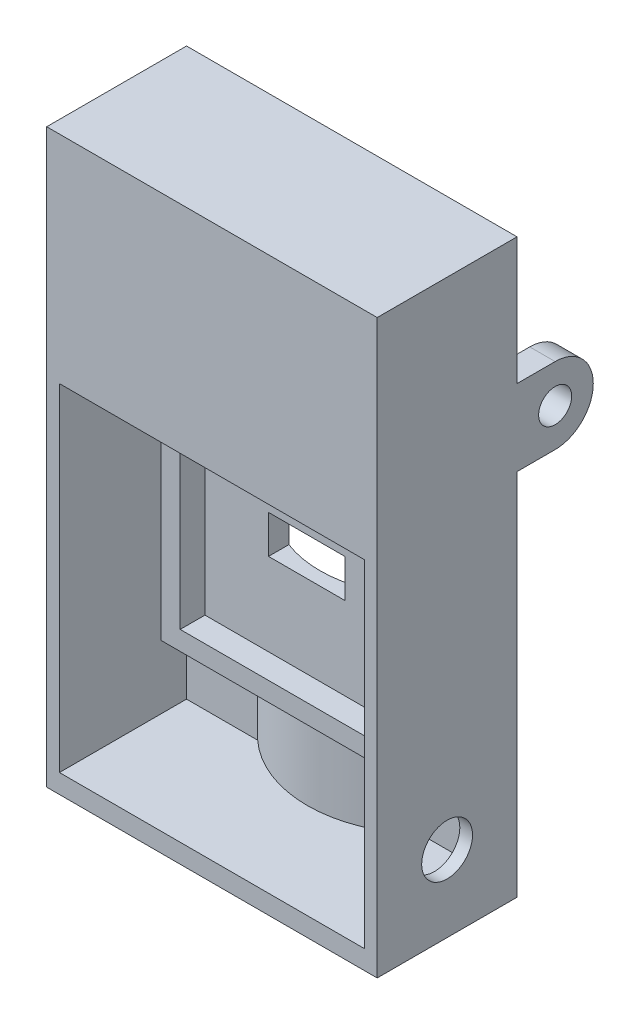
ISO-10303-21;
HEADER;
FILE_DESCRIPTION(('STEP AP214'),'2;1');
FILE_NAME('part.step','',(''),(''),'','','');
FILE_SCHEMA(('AUTOMOTIVE_DESIGN { 1 0 10303 214 1 1 1 1 }'));
ENDSEC;
DATA;
#1=APPLICATION_CONTEXT('core data for automotive mechanical design processes');
#2=APPLICATION_PROTOCOL_DEFINITION('international standard','automotive_design',2000,#1);
#3=PRODUCT_CONTEXT('',#1,'mechanical');
#4=PRODUCT('Part','Part','',(#3));
#5=PRODUCT_RELATED_PRODUCT_CATEGORY('part','',(#4));
#6=PRODUCT_DEFINITION_FORMATION('','',#4);
#7=PRODUCT_DEFINITION_CONTEXT('part definition',#1,'design');
#8=PRODUCT_DEFINITION('design','',#6,#7);
#9=PRODUCT_DEFINITION_SHAPE('','',#8);
#10=(LENGTH_UNIT() NAMED_UNIT(*) SI_UNIT(.MILLI.,.METRE.));
#11=(NAMED_UNIT(*) PLANE_ANGLE_UNIT() SI_UNIT($,.RADIAN.));
#12=(NAMED_UNIT(*) SI_UNIT($,.STERADIAN.) SOLID_ANGLE_UNIT());
#13=UNCERTAINTY_MEASURE_WITH_UNIT(LENGTH_MEASURE(1.E-05),#10,'distance_accuracy_value','');
#14=(GEOMETRIC_REPRESENTATION_CONTEXT(3) GLOBAL_UNCERTAINTY_ASSIGNED_CONTEXT((#13)) GLOBAL_UNIT_ASSIGNED_CONTEXT((#10,
#11,#12)) REPRESENTATION_CONTEXT('',''));
#15=CARTESIAN_POINT('',(0.,0.,0.));
#16=DIRECTION('',(0.,0.,1.));
#17=DIRECTION('',(1.,0.,0.));
#18=AXIS2_PLACEMENT_3D('',#15,#16,#17);
#19=CARTESIAN_POINT('',(-8.48528137423856,-16.,-3.));
#20=DIRECTION('',(0.,-1.,0.));
#21=DIRECTION('',(1.,0.,0.));
#22=AXIS2_PLACEMENT_3D('',#19,#20,#21);
#23=PLANE('',#22);
#24=DIRECTION('',(1.,0.,0.));
#25=VECTOR('',#24,1.);
#26=CARTESIAN_POINT('',(-8.48528137423856,-16.,-3.));
#27=LINE('',#26,#25);
#28=CARTESIAN_POINT('',(0.,-16.,-3.));
#29=VERTEX_POINT('',#28);
#30=CARTESIAN_POINT('',(2.,-16.,-3.));
#31=VERTEX_POINT('',#30);
#32=EDGE_CURVE('E280',#29,#31,#27,.T.);
#33=ORIENTED_EDGE('',*,*,#32,.T.);
#34=DIRECTION('',(0.,0.,1.));
#35=VECTOR('',#34,1.);
#36=CARTESIAN_POINT('',(2.,-16.,-3.));
#37=LINE('',#36,#35);
#38=CARTESIAN_POINT('',(2.,-16.,0.));
#39=VERTEX_POINT('',#38);
#40=EDGE_CURVE('E643',#31,#39,#37,.T.);
#41=ORIENTED_EDGE('',*,*,#40,.T.);
#42=DIRECTION('',(1.,0.,0.));
#43=VECTOR('',#42,1.);
#44=CARTESIAN_POINT('',(-8.48528137423856,-16.,0.));
#45=LINE('',#44,#43);
#46=CARTESIAN_POINT('',(0.,-16.,0.));
#47=VERTEX_POINT('',#46);
#48=EDGE_CURVE('E57',#47,#39,#45,.T.);
#49=ORIENTED_EDGE('',*,*,#48,.F.);
#50=DIRECTION('',(0.,0.,1.));
#51=VECTOR('',#50,1.);
#52=CARTESIAN_POINT('',(0.,-16.,-3.));
#53=LINE('',#52,#51);
#54=EDGE_CURVE('E290',#29,#47,#53,.T.);
#55=ORIENTED_EDGE('',*,*,#54,.F.);
#56=EDGE_LOOP('',(#33,#41,#49,#55));
#57=FACE_BOUND('',#56,.T.);
#58=ADVANCED_FACE('F33',(#57),#23,.T.);
#59=CARTESIAN_POINT('',(24.,-16.,0.));
#60=VERTEX_POINT('',#59);
#61=CARTESIAN_POINT('',(26.,-16.,0.));
#62=VERTEX_POINT('',#61);
#63=EDGE_CURVE('E285',#60,#62,#45,.T.);
#64=ORIENTED_EDGE('',*,*,#63,.F.);
#65=DIRECTION('',(0.,0.,-1.));
#66=VECTOR('',#65,1.);
#67=CARTESIAN_POINT('',(24.,-16.,-3.));
#68=LINE('',#67,#66);
#69=CARTESIAN_POINT('',(24.,-16.,-3.));
#70=VERTEX_POINT('',#69);
#71=EDGE_CURVE('E252',#60,#70,#68,.T.);
#72=ORIENTED_EDGE('',*,*,#71,.T.);
#73=CARTESIAN_POINT('',(26.,-16.,-3.));
#74=VERTEX_POINT('',#73);
#75=EDGE_CURVE('E283',#70,#74,#27,.T.);
#76=ORIENTED_EDGE('',*,*,#75,.T.);
#77=DIRECTION('',(0.,0.,-1.));
#78=VECTOR('',#77,1.);
#79=CARTESIAN_POINT('',(26.,-16.,-3.));
#80=LINE('',#79,#78);
#81=EDGE_CURVE('E648',#62,#74,#80,.T.);
#82=ORIENTED_EDGE('',*,*,#81,.F.);
#83=EDGE_LOOP('',(#64,#72,#76,#82));
#84=FACE_BOUND('',#83,.T.);
#85=ADVANCED_FACE('F498',(#84),#23,.T.);
#86=CARTESIAN_POINT('',(-8.48528137423856,-13.,-3.));
#87=DIRECTION('',(1.,0.,0.));
#88=DIRECTION('',(0.,1.,0.));
#89=AXIS2_PLACEMENT_3D('',#86,#87,#88);
#90=CYLINDRICAL_SURFACE('',#89,3.);
#91=DIRECTION('',(1.,0.,0.));
#92=VECTOR('',#91,1.);
#93=CARTESIAN_POINT('',(-8.48528137423856,-10.,-3.));
#94=LINE('',#93,#92);
#95=CARTESIAN_POINT('',(0.,-10.,-3.));
#96=VERTEX_POINT('',#95);
#97=CARTESIAN_POINT('',(2.,-10.,-3.));
#98=VERTEX_POINT('',#97);
#99=EDGE_CURVE('E270',#96,#98,#94,.T.);
#100=ORIENTED_EDGE('',*,*,#99,.T.);
#101=CARTESIAN_POINT('',(2.,-13.,-3.));
#102=DIRECTION('',(1.,0.,0.));
#103=DIRECTION('',(0.,0.,-1.));
#104=AXIS2_PLACEMENT_3D('',#101,#102,#103);
#105=CIRCLE('',#104,3.);
#106=EDGE_CURVE('E661',#98,#31,#105,.F.);
#107=ORIENTED_EDGE('',*,*,#106,.T.);
#108=ORIENTED_EDGE('',*,*,#32,.F.);
#109=CARTESIAN_POINT('',(0.,-13.,-3.));
#110=DIRECTION('',(1.,0.,0.));
#111=DIRECTION('',(0.,1.,0.));
#112=AXIS2_PLACEMENT_3D('',#109,#110,#111);
#113=CIRCLE('',#112,3.);
#114=EDGE_CURVE('E273',#96,#29,#113,.F.);
#115=ORIENTED_EDGE('',*,*,#114,.F.);
#116=EDGE_LOOP('',(#100,#107,#108,#115));
#117=FACE_BOUND('',#116,.T.);
#118=ADVANCED_FACE('F503',(#117),#90,.T.);
#119=ORIENTED_EDGE('',*,*,#75,.F.);
#120=CARTESIAN_POINT('',(24.,-13.,-3.));
#121=DIRECTION('',(-1.,0.,0.));
#122=DIRECTION('',(0.,0.,1.));
#123=AXIS2_PLACEMENT_3D('',#120,#121,#122);
#124=CIRCLE('',#123,3.);
#125=CARTESIAN_POINT('',(24.,-10.,-3.));
#126=VERTEX_POINT('',#125);
#127=EDGE_CURVE('E263',#70,#126,#124,.F.);
#128=ORIENTED_EDGE('',*,*,#127,.T.);
#129=CARTESIAN_POINT('',(26.,-10.,-3.));
#130=VERTEX_POINT('',#129);
#131=EDGE_CURVE('E262',#126,#130,#94,.T.);
#132=ORIENTED_EDGE('',*,*,#131,.T.);
#133=CARTESIAN_POINT('',(26.,-13.,-3.));
#134=DIRECTION('',(1.,0.,0.));
#135=DIRECTION('',(0.,-1.,0.));
#136=AXIS2_PLACEMENT_3D('',#133,#134,#135);
#137=CIRCLE('',#136,3.);
#138=EDGE_CURVE('E649',#74,#130,#137,.T.);
#139=ORIENTED_EDGE('',*,*,#138,.F.);
#140=EDGE_LOOP('',(#119,#128,#132,#139));
#141=FACE_BOUND('',#140,.T.);
#142=ADVANCED_FACE('F655',(#141),#90,.T.);
#143=CARTESIAN_POINT('',(-8.48528137423856,-10.,0.));
#144=DIRECTION('',(0.,1.,0.));
#145=DIRECTION('',(-1.,0.,0.));
#146=AXIS2_PLACEMENT_3D('',#143,#144,#145);
#147=PLANE('',#146);
#148=DIRECTION('',(1.,0.,0.));
#149=VECTOR('',#148,1.);
#150=CARTESIAN_POINT('',(-8.48528137423856,-10.,0.));
#151=LINE('',#150,#149);
#152=CARTESIAN_POINT('',(0.,-10.,0.));
#153=VERTEX_POINT('',#152);
#154=CARTESIAN_POINT('',(2.,-10.,0.));
#155=VERTEX_POINT('',#154);
#156=EDGE_CURVE('E269',#153,#155,#151,.T.);
#157=ORIENTED_EDGE('',*,*,#156,.T.);
#158=DIRECTION('',(0.,0.,-1.));
#159=VECTOR('',#158,1.);
#160=CARTESIAN_POINT('',(2.,-10.,0.));
#161=LINE('',#160,#159);
#162=EDGE_CURVE('E659',#155,#98,#161,.T.);
#163=ORIENTED_EDGE('',*,*,#162,.T.);
#164=ORIENTED_EDGE('',*,*,#99,.F.);
#165=DIRECTION('',(0.,0.,-1.));
#166=VECTOR('',#165,1.);
#167=CARTESIAN_POINT('',(0.,-10.,0.));
#168=LINE('',#167,#166);
#169=EDGE_CURVE('E638',#153,#96,#168,.T.);
#170=ORIENTED_EDGE('',*,*,#169,.F.);
#171=EDGE_LOOP('',(#157,#163,#164,#170));
#172=FACE_BOUND('',#171,.T.);
#173=ADVANCED_FACE('F669',(#172),#147,.T.);
#174=ORIENTED_EDGE('',*,*,#131,.F.);
#175=DIRECTION('',(0.,0.,1.));
#176=VECTOR('',#175,1.);
#177=CARTESIAN_POINT('',(24.,-10.,0.));
#178=LINE('',#177,#176);
#179=CARTESIAN_POINT('',(24.,-10.,0.));
#180=VERTEX_POINT('',#179);
#181=EDGE_CURVE('E249',#126,#180,#178,.T.);
#182=ORIENTED_EDGE('',*,*,#181,.T.);
#183=CARTESIAN_POINT('',(26.,-10.,0.));
#184=VERTEX_POINT('',#183);
#185=EDGE_CURVE('E260',#180,#184,#151,.T.);
#186=ORIENTED_EDGE('',*,*,#185,.T.);
#187=DIRECTION('',(0.,0.,1.));
#188=VECTOR('',#187,1.);
#189=CARTESIAN_POINT('',(26.,-10.,0.));
#190=LINE('',#189,#188);
#191=EDGE_CURVE('E277',#130,#184,#190,.T.);
#192=ORIENTED_EDGE('',*,*,#191,.F.);
#193=EDGE_LOOP('',(#174,#182,#186,#192));
#194=FACE_BOUND('',#193,.T.);
#195=ADVANCED_FACE('F258',(#194),#147,.T.);
#196=CARTESIAN_POINT('',(-8.48528137423856,-13.,-3.));
#197=DIRECTION('',(1.,0.,0.));
#198=DIRECTION('',(0.,1.,0.));
#199=AXIS2_PLACEMENT_3D('',#196,#197,#198);
#200=CYLINDRICAL_SURFACE('',#199,1.3);
#201=CARTESIAN_POINT('',(0.,-13.,-3.));
#202=DIRECTION('',(1.,0.,0.));
#203=DIRECTION('',(0.,1.,0.));
#204=AXIS2_PLACEMENT_3D('',#201,#202,#203);
#205=CIRCLE('',#204,1.3);
#206=CARTESIAN_POINT('',(0.,-11.7,-3.));
#207=VERTEX_POINT('',#206);
#208=EDGE_CURVE('E286',#207,#207,#205,.F.);
#209=ORIENTED_EDGE('',*,*,#208,.T.);
#210=EDGE_LOOP('',(#209));
#211=FACE_BOUND('',#210,.T.);
#212=CARTESIAN_POINT('',(2.,-13.,-3.));
#213=DIRECTION('',(1.,0.,0.));
#214=DIRECTION('',(0.,0.,-1.));
#215=AXIS2_PLACEMENT_3D('',#212,#213,#214);
#216=CIRCLE('',#215,1.3);
#217=CARTESIAN_POINT('',(2.,-13.,-4.3));
#218=VERTEX_POINT('',#217);
#219=EDGE_CURVE('E37',#218,#218,#216,.F.);
#220=ORIENTED_EDGE('',*,*,#219,.F.);
#221=EDGE_LOOP('',(#220));
#222=FACE_BOUND('',#221,.T.);
#223=ADVANCED_FACE('F483',(#211,#222),#200,.F.);
#224=CARTESIAN_POINT('',(26.,-13.,-3.));
#225=DIRECTION('',(1.,0.,0.));
#226=DIRECTION('',(0.,1.,0.));
#227=AXIS2_PLACEMENT_3D('',#224,#225,#226);
#228=CIRCLE('',#227,1.3);
#229=CARTESIAN_POINT('',(26.,-11.7,-3.));
#230=VERTEX_POINT('',#229);
#231=EDGE_CURVE('E646',#230,#230,#228,.T.);
#232=ORIENTED_EDGE('',*,*,#231,.T.);
#233=EDGE_LOOP('',(#232));
#234=FACE_BOUND('',#233,.T.);
#235=CARTESIAN_POINT('',(24.,-13.,-3.));
#236=DIRECTION('',(-1.,0.,0.));
#237=DIRECTION('',(0.,0.,1.));
#238=AXIS2_PLACEMENT_3D('',#235,#236,#237);
#239=CIRCLE('',#238,1.3);
#240=CARTESIAN_POINT('',(24.,-13.,-1.7));
#241=VERTEX_POINT('',#240);
#242=EDGE_CURVE('E255',#241,#241,#239,.F.);
#243=ORIENTED_EDGE('',*,*,#242,.F.);
#244=EDGE_LOOP('',(#243));
#245=FACE_BOUND('',#244,.T.);
#246=ADVANCED_FACE('F480',(#234,#245),#200,.F.);
#247=CARTESIAN_POINT('',(19.4031242374329,-17.,1.));
#248=DIRECTION('',(0.,0.,-1.));
#249=DIRECTION('',(-1.,0.,0.));
#250=AXIS2_PLACEMENT_3D('',#247,#248,#249);
#251=PLANE('',#250);
#252=DIRECTION('',(0.,1.,0.));
#253=VECTOR('',#252,1.);
#254=CARTESIAN_POINT('',(22.5,-36.,1.));
#255=LINE('',#254,#253);
#256=CARTESIAN_POINT('',(22.5,-36.,1.));
#257=VERTEX_POINT('',#256);
#258=CARTESIAN_POINT('',(22.5,-17.,1.));
#259=VERTEX_POINT('',#258);
#260=EDGE_CURVE('E365',#257,#259,#255,.T.);
#261=ORIENTED_EDGE('',*,*,#260,.F.);
#262=DIRECTION('',(1.,0.,0.));
#263=VECTOR('',#262,1.);
#264=CARTESIAN_POINT('',(22.5,-36.,1.));
#265=LINE('',#264,#263);
#266=CARTESIAN_POINT('',(19.4031242374329,-36.,1.));
#267=VERTEX_POINT('',#266);
#268=EDGE_CURVE('E341',#267,#257,#265,.T.);
#269=ORIENTED_EDGE('',*,*,#268,.F.);
#270=DIRECTION('',(0.,-1.,0.));
#271=VECTOR('',#270,1.);
#272=CARTESIAN_POINT('',(19.4031242374329,-17.,1.));
#273=LINE('',#272,#271);
#274=CARTESIAN_POINT('',(19.4031242374329,-43.5,1.));
#275=VERTEX_POINT('',#274);
#276=EDGE_CURVE('E426',#267,#275,#273,.T.);
#277=ORIENTED_EDGE('',*,*,#276,.T.);
#278=DIRECTION('',(1.,0.,0.));
#279=VECTOR('',#278,1.);
#280=CARTESIAN_POINT('',(19.4031242374329,-43.5,1.));
#281=LINE('',#280,#279);
#282=CARTESIAN_POINT('',(25.,-43.5,1.));
#283=VERTEX_POINT('',#282);
#284=EDGE_CURVE('E415',#275,#283,#281,.T.);
#285=ORIENTED_EDGE('',*,*,#284,.T.);
#286=DIRECTION('',(0.,-1.,0.));
#287=VECTOR('',#286,1.);
#288=CARTESIAN_POINT('',(25.,-17.,1.));
#289=LINE('',#288,#287);
#290=CARTESIAN_POINT('',(25.,-17.,1.));
#291=VERTEX_POINT('',#290);
#292=EDGE_CURVE('E424',#291,#283,#289,.T.);
#293=ORIENTED_EDGE('',*,*,#292,.F.);
#294=DIRECTION('',(1.,0.,0.));
#295=VECTOR('',#294,1.);
#296=CARTESIAN_POINT('',(19.4031242374329,-17.,1.));
#297=LINE('',#296,#295);
#298=EDGE_CURVE('E398',#259,#291,#297,.T.);
#299=ORIENTED_EDGE('',*,*,#298,.F.);
#300=EDGE_LOOP('',(#261,#269,#277,#285,#293,#299));
#301=FACE_BOUND('',#300,.T.);
#302=ADVANCED_FACE('F482',(#301),#251,.F.);
#303=CARTESIAN_POINT('',(1.00000000000002,-17.,1.));
#304=DIRECTION('',(0.,0.,-1.));
#305=DIRECTION('',(-1.,0.,0.));
#306=AXIS2_PLACEMENT_3D('',#303,#304,#305);
#307=PLANE('',#306);
#308=DIRECTION('',(0.,1.,0.));
#309=VECTOR('',#308,1.);
#310=CARTESIAN_POINT('',(3.50000000000001,-36.,1.));
#311=LINE('',#310,#309);
#312=CARTESIAN_POINT('',(3.50000000000001,-36.,1.));
#313=VERTEX_POINT('',#312);
#314=CARTESIAN_POINT('',(3.50000000000001,-17.,1.));
#315=VERTEX_POINT('',#314);
#316=EDGE_CURVE('E352',#313,#315,#311,.T.);
#317=ORIENTED_EDGE('',*,*,#316,.T.);
#318=DIRECTION('',(1.,0.,0.));
#319=VECTOR('',#318,1.);
#320=CARTESIAN_POINT('',(1.00000000000002,-17.,1.));
#321=LINE('',#320,#319);
#322=CARTESIAN_POINT('',(1.00000000000002,-17.,1.));
#323=VERTEX_POINT('',#322);
#324=EDGE_CURVE('E395',#323,#315,#321,.T.);
#325=ORIENTED_EDGE('',*,*,#324,.F.);
#326=DIRECTION('',(0.,-1.,0.));
#327=VECTOR('',#326,1.);
#328=CARTESIAN_POINT('',(1.00000000000002,-17.,1.));
#329=LINE('',#328,#327);
#330=CARTESIAN_POINT('',(1.00000000000002,-43.5,1.));
#331=VERTEX_POINT('',#330);
#332=EDGE_CURVE('E430',#323,#331,#329,.T.);
#333=ORIENTED_EDGE('',*,*,#332,.T.);
#334=DIRECTION('',(1.,0.,0.));
#335=VECTOR('',#334,1.);
#336=CARTESIAN_POINT('',(1.00000000000002,-43.5,1.));
#337=LINE('',#336,#335);
#338=CARTESIAN_POINT('',(6.59687576256716,-43.5,1.));
#339=VERTEX_POINT('',#338);
#340=EDGE_CURVE('E409',#331,#339,#337,.T.);
#341=ORIENTED_EDGE('',*,*,#340,.T.);
#342=DIRECTION('',(0.,-1.,0.));
#343=VECTOR('',#342,1.);
#344=CARTESIAN_POINT('',(6.59687576256717,-17.,1.));
#345=LINE('',#344,#343);
#346=CARTESIAN_POINT('',(6.59687576256716,-36.,1.));
#347=VERTEX_POINT('',#346);
#348=EDGE_CURVE('E428',#347,#339,#345,.T.);
#349=ORIENTED_EDGE('',*,*,#348,.F.);
#350=DIRECTION('',(1.,0.,0.));
#351=VECTOR('',#350,1.);
#352=CARTESIAN_POINT('',(6.59687576256716,-36.,1.));
#353=LINE('',#352,#351);
#354=EDGE_CURVE('E350',#313,#347,#353,.T.);
#355=ORIENTED_EDGE('',*,*,#354,.F.);
#356=EDGE_LOOP('',(#317,#325,#333,#341,#349,#355));
#357=FACE_BOUND('',#356,.T.);
#358=ADVANCED_FACE('F490',(#357),#307,.F.);
#359=CARTESIAN_POINT('',(13.,-17.,-5.95));
#360=DIRECTION('',(0.,-1.,0.));
#361=DIRECTION('',(1.,0.,0.));
#362=AXIS2_PLACEMENT_3D('',#359,#360,#361);
#363=PLANE('',#362);
#364=DIRECTION('',(-1.,0.,0.));
#365=VECTOR('',#364,1.);
#366=CARTESIAN_POINT('',(3.50000000000001,-17.,5.5));
#367=LINE('',#366,#365);
#368=CARTESIAN_POINT('',(22.5,-17.,5.5));
#369=VERTEX_POINT('',#368);
#370=CARTESIAN_POINT('',(3.50000000000001,-17.,5.5));
#371=VERTEX_POINT('',#370);
#372=EDGE_CURVE('E354',#369,#371,#367,.T.);
#373=ORIENTED_EDGE('',*,*,#372,.F.);
#374=DIRECTION('',(0.,0.,1.));
#375=VECTOR('',#374,1.);
#376=CARTESIAN_POINT('',(22.5,-17.,5.5));
#377=LINE('',#376,#375);
#378=EDGE_CURVE('E332',#259,#369,#377,.T.);
#379=ORIENTED_EDGE('',*,*,#378,.F.);
#380=ORIENTED_EDGE('',*,*,#298,.T.);
#381=DIRECTION('',(0.,0.,1.));
#382=VECTOR('',#381,1.);
#383=CARTESIAN_POINT('',(25.,-17.,1.));
#384=LINE('',#383,#382);
#385=CARTESIAN_POINT('',(25.,-17.,11.));
#386=VERTEX_POINT('',#385);
#387=EDGE_CURVE('E400',#291,#386,#384,.T.);
#388=ORIENTED_EDGE('',*,*,#387,.T.);
#389=DIRECTION('',(-1.,0.,0.));
#390=VECTOR('',#389,1.);
#391=CARTESIAN_POINT('',(1.00000000000002,-17.,11.));
#392=LINE('',#391,#390);
#393=CARTESIAN_POINT('',(1.00000000000002,-17.,11.));
#394=VERTEX_POINT('',#393);
#395=EDGE_CURVE('E388',#386,#394,#392,.T.);
#396=ORIENTED_EDGE('',*,*,#395,.T.);
#397=DIRECTION('',(0.,0.,-1.));
#398=VECTOR('',#397,1.);
#399=CARTESIAN_POINT('',(1.00000000000002,-17.,11.));
#400=LINE('',#399,#398);
#401=EDGE_CURVE('E391',#394,#323,#400,.T.);
#402=ORIENTED_EDGE('',*,*,#401,.T.);
#403=ORIENTED_EDGE('',*,*,#324,.T.);
#404=DIRECTION('',(0.,0.,-1.));
#405=VECTOR('',#404,1.);
#406=CARTESIAN_POINT('',(3.50000000000001,-17.,1.));
#407=LINE('',#406,#405);
#408=EDGE_CURVE('E342',#371,#315,#407,.T.);
#409=ORIENTED_EDGE('',*,*,#408,.F.);
#410=EDGE_LOOP('',(#373,#379,#380,#388,#396,#402,#403,#409));
#411=FACE_BOUND('',#410,.T.);
#412=ADVANCED_FACE('F565',(#411),#363,.T.);
#413=CARTESIAN_POINT('',(0.,0.,11.));
#414=DIRECTION('',(0.,0.,1.));
#415=DIRECTION('',(1.,0.,0.));
#416=AXIS2_PLACEMENT_3D('',#413,#414,#415);
#417=PLANE('',#416);
#418=DIRECTION('',(0.,-1.,0.));
#419=VECTOR('',#418,1.);
#420=CARTESIAN_POINT('',(0.,0.,11.));
#421=LINE('',#420,#419);
#422=CARTESIAN_POINT('',(0.,0.,11.));
#423=VERTEX_POINT('',#422);
#424=CARTESIAN_POINT('',(0.,-45.,11.));
#425=VERTEX_POINT('',#424);
#426=EDGE_CURVE('E439',#423,#425,#421,.T.);
#427=ORIENTED_EDGE('',*,*,#426,.T.);
#428=DIRECTION('',(1.,0.,0.));
#429=VECTOR('',#428,1.);
#430=CARTESIAN_POINT('',(0.,-45.,11.));
#431=LINE('',#430,#429);
#432=CARTESIAN_POINT('',(26.,-45.,11.));
#433=VERTEX_POINT('',#432);
#434=EDGE_CURVE('E442',#425,#433,#431,.T.);
#435=ORIENTED_EDGE('',*,*,#434,.T.);
#436=DIRECTION('',(0.,1.,0.));
#437=VECTOR('',#436,1.);
#438=CARTESIAN_POINT('',(26.,0.,11.));
#439=LINE('',#438,#437);
#440=CARTESIAN_POINT('',(26.,0.,11.));
#441=VERTEX_POINT('',#440);
#442=EDGE_CURVE('E445',#433,#441,#439,.T.);
#443=ORIENTED_EDGE('',*,*,#442,.T.);
#444=DIRECTION('',(-1.,0.,0.));
#445=VECTOR('',#444,1.);
#446=CARTESIAN_POINT('',(0.,0.,11.));
#447=LINE('',#446,#445);
#448=EDGE_CURVE('E447',#441,#423,#447,.T.);
#449=ORIENTED_EDGE('',*,*,#448,.T.);
#450=EDGE_LOOP('',(#427,#435,#443,#449));
#451=FACE_BOUND('',#450,.T.);
#452=DIRECTION('',(0.,-1.,0.));
#453=VECTOR('',#452,1.);
#454=CARTESIAN_POINT('',(1.00000000000002,-17.,11.));
#455=LINE('',#454,#453);
#456=CARTESIAN_POINT('',(1.00000000000002,-43.5,11.));
#457=VERTEX_POINT('',#456);
#458=EDGE_CURVE('E403',#394,#457,#455,.T.);
#459=ORIENTED_EDGE('',*,*,#458,.F.);
#460=ORIENTED_EDGE('',*,*,#395,.F.);
#461=DIRECTION('',(0.,-1.,0.));
#462=VECTOR('',#461,1.);
#463=CARTESIAN_POINT('',(25.,-17.,11.));
#464=LINE('',#463,#462);
#465=CARTESIAN_POINT('',(25.,-43.5,11.));
#466=VERTEX_POINT('',#465);
#467=EDGE_CURVE('E420',#386,#466,#464,.T.);
#468=ORIENTED_EDGE('',*,*,#467,.T.);
#469=DIRECTION('',(-1.,0.,0.));
#470=VECTOR('',#469,1.);
#471=CARTESIAN_POINT('',(1.00000000000002,-43.5,11.));
#472=LINE('',#471,#470);
#473=EDGE_CURVE('E387',#466,#457,#472,.T.);
#474=ORIENTED_EDGE('',*,*,#473,.T.);
#475=EDGE_LOOP('',(#459,#460,#468,#474));
#476=FACE_BOUND('',#475,.T.);
#477=ADVANCED_FACE('F568',(#451,#476),#417,.T.);
#478=CARTESIAN_POINT('',(0.,0.,11.));
#479=DIRECTION('',(1.,0.,0.));
#480=DIRECTION('',(0.,1.,0.));
#481=AXIS2_PLACEMENT_3D('',#478,#479,#480);
#482=PLANE('',#481);
#483=DIRECTION('',(0.,-1.,0.));
#484=VECTOR('',#483,1.);
#485=CARTESIAN_POINT('',(0.,0.,0.));
#486=LINE('',#485,#484);
#487=CARTESIAN_POINT('',(0.,0.,0.));
#488=VERTEX_POINT('',#487);
#489=EDGE_CURVE('E450',#488,#153,#486,.T.);
#490=ORIENTED_EDGE('',*,*,#489,.T.);
#491=ORIENTED_EDGE('',*,*,#169,.T.);
#492=ORIENTED_EDGE('',*,*,#114,.T.);
#493=ORIENTED_EDGE('',*,*,#54,.T.);
#494=CARTESIAN_POINT('',(0.,-45.,0.));
#495=VERTEX_POINT('',#494);
#496=EDGE_CURVE('E436',#47,#495,#486,.T.);
#497=ORIENTED_EDGE('',*,*,#496,.T.);
#498=DIRECTION('',(0.,0.,-1.));
#499=VECTOR('',#498,1.);
#500=CARTESIAN_POINT('',(0.,-45.,11.));
#501=LINE('',#500,#499);
#502=EDGE_CURVE('E469',#425,#495,#501,.T.);
#503=ORIENTED_EDGE('',*,*,#502,.F.);
#504=ORIENTED_EDGE('',*,*,#426,.F.);
#505=DIRECTION('',(0.,0.,-1.));
#506=VECTOR('',#505,1.);
#507=CARTESIAN_POINT('',(0.,0.,11.));
#508=LINE('',#507,#506);
#509=EDGE_CURVE('E449',#423,#488,#508,.T.);
#510=ORIENTED_EDGE('',*,*,#509,.T.);
#511=EDGE_LOOP('',(#490,#491,#492,#493,#497,#503,#504,#510));
#512=FACE_BOUND('',#511,.T.);
#513=ORIENTED_EDGE('',*,*,#208,.F.);
#514=EDGE_LOOP('',(#513));
#515=FACE_BOUND('',#514,.T.);
#516=ADVANCED_FACE('F35',(#512,#515),#482,.F.);
#517=CARTESIAN_POINT('',(0.,-45.,11.));
#518=DIRECTION('',(0.,1.,0.));
#519=DIRECTION('',(0.,0.,1.));
#520=AXIS2_PLACEMENT_3D('',#517,#518,#519);
#521=PLANE('',#520);
#522=DIRECTION('',(1.,0.,0.));
#523=VECTOR('',#522,1.);
#524=CARTESIAN_POINT('',(0.,-45.,0.));
#525=LINE('',#524,#523);
#526=CARTESIAN_POINT('',(7.00000000000001,-45.,0.));
#527=VERTEX_POINT('',#526);
#528=EDGE_CURVE('E454',#495,#527,#525,.T.);
#529=ORIENTED_EDGE('',*,*,#528,.T.);
#530=CARTESIAN_POINT('',(13.,-45.,-5.95));
#531=DIRECTION('',(0.,-1.,0.));
#532=DIRECTION('',(1.,0.,0.));
#533=AXIS2_PLACEMENT_3D('',#530,#531,#532);
#534=CIRCLE('',#533,8.45);
#535=CARTESIAN_POINT('',(19.,-45.,0.));
#536=VERTEX_POINT('',#535);
#537=EDGE_CURVE('E423',#536,#527,#534,.T.);
#538=ORIENTED_EDGE('',*,*,#537,.F.);
#539=CARTESIAN_POINT('',(26.,-45.,0.));
#540=VERTEX_POINT('',#539);
#541=EDGE_CURVE('E453',#536,#540,#525,.T.);
#542=ORIENTED_EDGE('',*,*,#541,.T.);
#543=DIRECTION('',(0.,0.,-1.));
#544=VECTOR('',#543,1.);
#545=CARTESIAN_POINT('',(26.,-45.,11.));
#546=LINE('',#545,#544);
#547=EDGE_CURVE('E466',#433,#540,#546,.T.);
#548=ORIENTED_EDGE('',*,*,#547,.F.);
#549=ORIENTED_EDGE('',*,*,#434,.F.);
#550=ORIENTED_EDGE('',*,*,#502,.T.);
#551=EDGE_LOOP('',(#529,#538,#542,#548,#549,#550));
#552=FACE_BOUND('',#551,.T.);
#553=ADVANCED_FACE('F607',(#552),#521,.F.);
#554=CARTESIAN_POINT('',(26.,0.,11.));
#555=DIRECTION('',(-1.,0.,0.));
#556=DIRECTION('',(0.,-1.,0.));
#557=AXIS2_PLACEMENT_3D('',#554,#555,#556);
#558=PLANE('',#557);
#559=CARTESIAN_POINT('',(26.,-39.,5.5));
#560=DIRECTION('',(1.,0.,0.));
#561=DIRECTION('',(0.,1.,0.));
#562=AXIS2_PLACEMENT_3D('',#559,#560,#561);
#563=CIRCLE('',#562,2.);
#564=CARTESIAN_POINT('',(26.,-37.,5.5));
#565=VERTEX_POINT('',#564);
#566=EDGE_CURVE('E289',#565,#565,#563,.T.);
#567=ORIENTED_EDGE('',*,*,#566,.F.);
#568=EDGE_LOOP('',(#567));
#569=FACE_BOUND('',#568,.T.);
#570=DIRECTION('',(0.,1.,0.));
#571=VECTOR('',#570,1.);
#572=CARTESIAN_POINT('',(26.,0.,0.));
#573=LINE('',#572,#571);
#574=EDGE_CURVE('E457',#540,#62,#573,.T.);
#575=ORIENTED_EDGE('',*,*,#574,.T.);
#576=ORIENTED_EDGE('',*,*,#81,.T.);
#577=ORIENTED_EDGE('',*,*,#138,.T.);
#578=ORIENTED_EDGE('',*,*,#191,.T.);
#579=CARTESIAN_POINT('',(26.,0.,0.));
#580=VERTEX_POINT('',#579);
#581=EDGE_CURVE('E268',#184,#580,#573,.T.);
#582=ORIENTED_EDGE('',*,*,#581,.T.);
#583=DIRECTION('',(0.,0.,-1.));
#584=VECTOR('',#583,1.);
#585=CARTESIAN_POINT('',(26.,0.,11.));
#586=LINE('',#585,#584);
#587=EDGE_CURVE('E463',#441,#580,#586,.T.);
#588=ORIENTED_EDGE('',*,*,#587,.F.);
#589=ORIENTED_EDGE('',*,*,#442,.F.);
#590=ORIENTED_EDGE('',*,*,#547,.T.);
#591=EDGE_LOOP('',(#575,#576,#577,#578,#582,#588,#589,#590));
#592=FACE_BOUND('',#591,.T.);
#593=ORIENTED_EDGE('',*,*,#231,.F.);
#594=EDGE_LOOP('',(#593));
#595=FACE_BOUND('',#594,.T.);
#596=ADVANCED_FACE('F604',(#569,#592,#595),#558,.F.);
#597=CARTESIAN_POINT('',(0.,0.,11.));
#598=DIRECTION('',(0.,-1.,0.));
#599=DIRECTION('',(0.,0.,-1.));
#600=AXIS2_PLACEMENT_3D('',#597,#598,#599);
#601=PLANE('',#600);
#602=DIRECTION('',(-1.,0.,0.));
#603=VECTOR('',#602,1.);
#604=CARTESIAN_POINT('',(0.,0.,0.));
#605=LINE('',#604,#603);
#606=EDGE_CURVE('E443',#580,#488,#605,.T.);
#607=ORIENTED_EDGE('',*,*,#606,.T.);
#608=ORIENTED_EDGE('',*,*,#509,.F.);
#609=ORIENTED_EDGE('',*,*,#448,.F.);
#610=ORIENTED_EDGE('',*,*,#587,.T.);
#611=EDGE_LOOP('',(#607,#608,#609,#610));
#612=FACE_BOUND('',#611,.T.);
#613=ADVANCED_FACE('F601',(#612),#601,.F.);
#614=CARTESIAN_POINT('',(0.,0.,0.));
#615=DIRECTION('',(0.,0.,1.));
#616=DIRECTION('',(1.,0.,0.));
#617=AXIS2_PLACEMENT_3D('',#614,#615,#616);
#618=PLANE('',#617);
#619=ORIENTED_EDGE('',*,*,#48,.T.);
#620=DIRECTION('',(0.,1.,0.));
#621=VECTOR('',#620,1.);
#622=CARTESIAN_POINT('',(2.,-18.1660980230305,0.));
#623=LINE('',#622,#621);
#624=EDGE_CURVE('E50',#39,#155,#623,.T.);
#625=ORIENTED_EDGE('',*,*,#624,.T.);
#626=ORIENTED_EDGE('',*,*,#156,.F.);
#627=ORIENTED_EDGE('',*,*,#489,.F.);
#628=ORIENTED_EDGE('',*,*,#606,.F.);
#629=ORIENTED_EDGE('',*,*,#581,.F.);
#630=ORIENTED_EDGE('',*,*,#185,.F.);
#631=DIRECTION('',(0.,-1.,0.));
#632=VECTOR('',#631,1.);
#633=CARTESIAN_POINT('',(24.,-18.1660980230305,0.));
#634=LINE('',#633,#632);
#635=EDGE_CURVE('E245',#180,#60,#634,.T.);
#636=ORIENTED_EDGE('',*,*,#635,.T.);
#637=ORIENTED_EDGE('',*,*,#63,.T.);
#638=ORIENTED_EDGE('',*,*,#574,.F.);
#639=ORIENTED_EDGE('',*,*,#541,.F.);
#640=DIRECTION('',(0.,-1.,0.));
#641=VECTOR('',#640,1.);
#642=CARTESIAN_POINT('',(19.,-17.,0.));
#643=LINE('',#642,#641);
#644=CARTESIAN_POINT('',(19.,-17.,0.));
#645=VERTEX_POINT('',#644);
#646=EDGE_CURVE('E42',#536,#645,#643,.F.);
#647=ORIENTED_EDGE('',*,*,#646,.T.);
#648=DIRECTION('',(1.,0.,0.));
#649=VECTOR('',#648,1.);
#650=CARTESIAN_POINT('',(0.,-17.,0.));
#651=LINE('',#650,#649);
#652=CARTESIAN_POINT('',(7.00000000000002,-17.,0.));
#653=VERTEX_POINT('',#652);
#654=EDGE_CURVE('E472',#653,#645,#651,.T.);
#655=ORIENTED_EDGE('',*,*,#654,.F.);
#656=DIRECTION('',(0.,-1.,0.));
#657=VECTOR('',#656,1.);
#658=CARTESIAN_POINT('',(7.00000000000002,-17.,0.));
#659=LINE('',#658,#657);
#660=EDGE_CURVE('E11',#653,#527,#659,.T.);
#661=ORIENTED_EDGE('',*,*,#660,.T.);
#662=ORIENTED_EDGE('',*,*,#528,.F.);
#663=ORIENTED_EDGE('',*,*,#496,.F.);
#664=EDGE_LOOP('',(#619,#625,#626,#627,#628,#629,#630,#636,#637,#638,#639,#647,#655,#661,#662,#663));
#665=FACE_BOUND('',#664,.T.);
#666=ADVANCED_FACE('F266',(#665),#618,.F.);
#667=CARTESIAN_POINT('',(13.,-17.,-5.95));
#668=DIRECTION('',(0.,-1.,0.));
#669=DIRECTION('',(1.,0.,0.));
#670=AXIS2_PLACEMENT_3D('',#667,#668,#669);
#671=CYLINDRICAL_SURFACE('',#670,8.45);
#672=CARTESIAN_POINT('',(13.,-25.,-5.95));
#673=DIRECTION('',(0.,1.,0.));
#674=DIRECTION('',(-1.,0.,0.));
#675=AXIS2_PLACEMENT_3D('',#672,#673,#674);
#676=CIRCLE('',#675,8.45);
#677=CARTESIAN_POINT('',(16.,-25.,1.94952530219381));
#678=VERTEX_POINT('',#677);
#679=CARTESIAN_POINT('',(10.,-25.,1.9495253021938));
#680=VERTEX_POINT('',#679);
#681=EDGE_CURVE('E381',#678,#680,#676,.F.);
#682=ORIENTED_EDGE('',*,*,#681,.T.);
#683=DIRECTION('',(0.,-1.,0.));
#684=VECTOR('',#683,1.);
#685=CARTESIAN_POINT('',(10.,-17.,1.94952530219379));
#686=LINE('',#685,#684);
#687=CARTESIAN_POINT('',(10.,-28.,1.9495253021938));
#688=VERTEX_POINT('',#687);
#689=EDGE_CURVE('E384',#680,#688,#686,.T.);
#690=ORIENTED_EDGE('',*,*,#689,.T.);
#691=CARTESIAN_POINT('',(13.,-28.,-5.95));
#692=DIRECTION('',(0.,-1.,0.));
#693=DIRECTION('',(1.,0.,0.));
#694=AXIS2_PLACEMENT_3D('',#691,#692,#693);
#695=CIRCLE('',#694,8.45);
#696=CARTESIAN_POINT('',(16.,-28.,1.9495253021938));
#697=VERTEX_POINT('',#696);
#698=EDGE_CURVE('E370',#688,#697,#695,.F.);
#699=ORIENTED_EDGE('',*,*,#698,.T.);
#700=DIRECTION('',(0.,-1.,0.));
#701=VECTOR('',#700,1.);
#702=CARTESIAN_POINT('',(16.,-17.,1.94952530219381));
#703=LINE('',#702,#701);
#704=EDGE_CURVE('E378',#697,#678,#703,.F.);
#705=ORIENTED_EDGE('',*,*,#704,.T.);
#706=EDGE_LOOP('',(#682,#690,#699,#705));
#707=FACE_BOUND('',#706,.T.);
#708=CARTESIAN_POINT('',(13.,-17.,-5.95));
#709=DIRECTION('',(0.,-1.,0.));
#710=DIRECTION('',(1.,0.,0.));
#711=AXIS2_PLACEMENT_3D('',#708,#709,#710);
#712=CIRCLE('',#711,8.45);
#713=EDGE_CURVE('E434',#645,#653,#712,.T.);
#714=ORIENTED_EDGE('',*,*,#713,.F.);
#715=ORIENTED_EDGE('',*,*,#646,.F.);
#716=ORIENTED_EDGE('',*,*,#537,.T.);
#717=ORIENTED_EDGE('',*,*,#660,.F.);
#718=EDGE_LOOP('',(#714,#715,#716,#717));
#719=FACE_BOUND('',#718,.T.);
#720=ADVANCED_FACE('F591',(#707,#719),#671,.F.);
#721=CARTESIAN_POINT('',(13.,-17.,-5.95));
#722=DIRECTION('',(0.,-1.,0.));
#723=DIRECTION('',(1.,0.,0.));
#724=AXIS2_PLACEMENT_3D('',#721,#722,#723);
#725=PLANE('',#724);
#726=ORIENTED_EDGE('',*,*,#654,.T.);
#727=ORIENTED_EDGE('',*,*,#713,.T.);
#728=EDGE_LOOP('',(#726,#727));
#729=FACE_BOUND('',#728,.T.);
#730=ADVANCED_FACE('F577',(#729),#725,.T.);
#731=CARTESIAN_POINT('',(25.,-17.,1.));
#732=DIRECTION('',(1.,0.,0.));
#733=DIRECTION('',(0.,1.,0.));
#734=AXIS2_PLACEMENT_3D('',#731,#732,#733);
#735=PLANE('',#734);
#736=CARTESIAN_POINT('',(25.,-39.,5.5));
#737=DIRECTION('',(1.,0.,0.));
#738=DIRECTION('',(0.,1.,0.));
#739=AXIS2_PLACEMENT_3D('',#736,#737,#738);
#740=CIRCLE('',#739,2.);
#741=CARTESIAN_POINT('',(25.,-37.,5.5));
#742=VERTEX_POINT('',#741);
#743=EDGE_CURVE('E293',#742,#742,#740,.T.);
#744=ORIENTED_EDGE('',*,*,#743,.T.);
#745=EDGE_LOOP('',(#744));
#746=FACE_BOUND('',#745,.T.);
#747=DIRECTION('',(0.,0.,1.));
#748=VECTOR('',#747,1.);
#749=CARTESIAN_POINT('',(25.,-43.5,1.));
#750=LINE('',#749,#748);
#751=EDGE_CURVE('E392',#283,#466,#750,.T.);
#752=ORIENTED_EDGE('',*,*,#751,.T.);
#753=ORIENTED_EDGE('',*,*,#467,.F.);
#754=ORIENTED_EDGE('',*,*,#387,.F.);
#755=ORIENTED_EDGE('',*,*,#292,.T.);
#756=EDGE_LOOP('',(#752,#753,#754,#755));
#757=FACE_BOUND('',#756,.T.);
#758=ADVANCED_FACE('F574',(#746,#757),#735,.F.);
#759=CARTESIAN_POINT('',(13.,-17.,-5.95));
#760=DIRECTION('',(0.,-1.,0.));
#761=DIRECTION('',(1.,0.,0.));
#762=AXIS2_PLACEMENT_3D('',#759,#760,#761);
#763=CYLINDRICAL_SURFACE('',#762,9.45);
#764=ORIENTED_EDGE('',*,*,#276,.F.);
#765=CARTESIAN_POINT('',(13.,-36.,-5.95));
#766=DIRECTION('',(0.,1.,0.));
#767=DIRECTION('',(1.,0.,0.));
#768=AXIS2_PLACEMENT_3D('',#765,#766,#767);
#769=CIRCLE('',#768,9.45);
#770=EDGE_CURVE('E339',#347,#267,#769,.T.);
#771=ORIENTED_EDGE('',*,*,#770,.F.);
#772=ORIENTED_EDGE('',*,*,#348,.T.);
#773=CARTESIAN_POINT('',(13.,-43.5,-5.95));
#774=DIRECTION('',(0.,1.,0.));
#775=DIRECTION('',(1.,0.,0.));
#776=AXIS2_PLACEMENT_3D('',#773,#774,#775);
#777=CIRCLE('',#776,9.45);
#778=EDGE_CURVE('E412',#339,#275,#777,.T.);
#779=ORIENTED_EDGE('',*,*,#778,.T.);
#780=EDGE_LOOP('',(#764,#771,#772,#779));
#781=FACE_BOUND('',#780,.T.);
#782=ADVANCED_FACE('F576',(#781),#763,.T.);
#783=CARTESIAN_POINT('',(1.00000000000002,-17.,11.));
#784=DIRECTION('',(-1.,0.,0.));
#785=DIRECTION('',(0.,-1.,0.));
#786=AXIS2_PLACEMENT_3D('',#783,#784,#785);
#787=PLANE('',#786);
#788=DIRECTION('',(0.,0.,-1.));
#789=VECTOR('',#788,1.);
#790=CARTESIAN_POINT('',(1.00000000000002,-43.5,11.));
#791=LINE('',#790,#789);
#792=EDGE_CURVE('E406',#457,#331,#791,.T.);
#793=ORIENTED_EDGE('',*,*,#792,.T.);
#794=ORIENTED_EDGE('',*,*,#332,.F.);
#795=ORIENTED_EDGE('',*,*,#401,.F.);
#796=ORIENTED_EDGE('',*,*,#458,.T.);
#797=EDGE_LOOP('',(#793,#794,#795,#796));
#798=FACE_BOUND('',#797,.T.);
#799=ADVANCED_FACE('F572',(#798),#787,.F.);
#800=CARTESIAN_POINT('',(13.,-43.5,-5.95));
#801=DIRECTION('',(0.,-1.,0.));
#802=DIRECTION('',(1.,0.,0.));
#803=AXIS2_PLACEMENT_3D('',#800,#801,#802);
#804=PLANE('',#803);
#805=ORIENTED_EDGE('',*,*,#473,.F.);
#806=ORIENTED_EDGE('',*,*,#751,.F.);
#807=ORIENTED_EDGE('',*,*,#284,.F.);
#808=ORIENTED_EDGE('',*,*,#778,.F.);
#809=ORIENTED_EDGE('',*,*,#340,.F.);
#810=ORIENTED_EDGE('',*,*,#792,.F.);
#811=EDGE_LOOP('',(#805,#806,#807,#808,#809,#810));
#812=FACE_BOUND('',#811,.T.);
#813=ADVANCED_FACE('F563',(#812),#804,.F.);
#814=CARTESIAN_POINT('',(10.,-25.,0.));
#815=DIRECTION('',(-1.,0.,0.));
#816=DIRECTION('',(0.,0.,1.));
#817=AXIS2_PLACEMENT_3D('',#814,#815,#816);
#818=PLANE('',#817);
#819=DIRECTION('',(0.,0.,1.));
#820=VECTOR('',#819,1.);
#821=CARTESIAN_POINT('',(10.,-25.,0.));
#822=LINE('',#821,#820);
#823=CARTESIAN_POINT('',(10.,-25.,3.55));
#824=VERTEX_POINT('',#823);
#825=EDGE_CURVE('E368',#680,#824,#822,.T.);
#826=ORIENTED_EDGE('',*,*,#825,.T.);
#827=DIRECTION('',(0.,-1.,0.));
#828=VECTOR('',#827,1.);
#829=CARTESIAN_POINT('',(10.,-25.,3.55));
#830=LINE('',#829,#828);
#831=CARTESIAN_POINT('',(10.,-28.,3.55));
#832=VERTEX_POINT('',#831);
#833=EDGE_CURVE('E294',#824,#832,#830,.T.);
#834=ORIENTED_EDGE('',*,*,#833,.T.);
#835=DIRECTION('',(0.,0.,1.));
#836=VECTOR('',#835,1.);
#837=CARTESIAN_POINT('',(10.,-28.,0.));
#838=LINE('',#837,#836);
#839=EDGE_CURVE('E367',#688,#832,#838,.T.);
#840=ORIENTED_EDGE('',*,*,#839,.F.);
#841=ORIENTED_EDGE('',*,*,#689,.F.);
#842=EDGE_LOOP('',(#826,#834,#840,#841));
#843=FACE_BOUND('',#842,.T.);
#844=ADVANCED_FACE('F553',(#843),#818,.F.);
#845=CARTESIAN_POINT('',(10.,-25.,0.));
#846=DIRECTION('',(0.,1.,0.));
#847=DIRECTION('',(-1.,0.,0.));
#848=AXIS2_PLACEMENT_3D('',#845,#846,#847);
#849=PLANE('',#848);
#850=DIRECTION('',(0.,0.,1.));
#851=VECTOR('',#850,1.);
#852=CARTESIAN_POINT('',(16.,-25.,0.));
#853=LINE('',#852,#851);
#854=CARTESIAN_POINT('',(16.,-25.,3.55));
#855=VERTEX_POINT('',#854);
#856=EDGE_CURVE('E371',#678,#855,#853,.T.);
#857=ORIENTED_EDGE('',*,*,#856,.T.);
#858=DIRECTION('',(-1.,0.,0.));
#859=VECTOR('',#858,1.);
#860=CARTESIAN_POINT('',(10.,-25.,3.55));
#861=LINE('',#860,#859);
#862=EDGE_CURVE('E303',#855,#824,#861,.T.);
#863=ORIENTED_EDGE('',*,*,#862,.T.);
#864=ORIENTED_EDGE('',*,*,#825,.F.);
#865=ORIENTED_EDGE('',*,*,#681,.F.);
#866=EDGE_LOOP('',(#857,#863,#864,#865));
#867=FACE_BOUND('',#866,.T.);
#868=ADVANCED_FACE('F549',(#867),#849,.F.);
#869=CARTESIAN_POINT('',(16.,-25.,0.));
#870=DIRECTION('',(1.,0.,0.));
#871=DIRECTION('',(0.,1.,0.));
#872=AXIS2_PLACEMENT_3D('',#869,#870,#871);
#873=PLANE('',#872);
#874=DIRECTION('',(0.,0.,1.));
#875=VECTOR('',#874,1.);
#876=CARTESIAN_POINT('',(16.,-28.,0.));
#877=LINE('',#876,#875);
#878=CARTESIAN_POINT('',(16.,-28.,3.55));
#879=VERTEX_POINT('',#878);
#880=EDGE_CURVE('E373',#697,#879,#877,.T.);
#881=ORIENTED_EDGE('',*,*,#880,.T.);
#882=DIRECTION('',(0.,1.,0.));
#883=VECTOR('',#882,1.);
#884=CARTESIAN_POINT('',(16.,-25.,3.55));
#885=LINE('',#884,#883);
#886=EDGE_CURVE('E300',#879,#855,#885,.T.);
#887=ORIENTED_EDGE('',*,*,#886,.T.);
#888=ORIENTED_EDGE('',*,*,#856,.F.);
#889=ORIENTED_EDGE('',*,*,#704,.F.);
#890=EDGE_LOOP('',(#881,#887,#888,#889));
#891=FACE_BOUND('',#890,.T.);
#892=ADVANCED_FACE('F552',(#891),#873,.F.);
#893=CARTESIAN_POINT('',(10.,-28.,0.));
#894=DIRECTION('',(0.,-1.,0.));
#895=DIRECTION('',(1.,0.,0.));
#896=AXIS2_PLACEMENT_3D('',#893,#894,#895);
#897=PLANE('',#896);
#898=ORIENTED_EDGE('',*,*,#839,.T.);
#899=DIRECTION('',(1.,0.,0.));
#900=VECTOR('',#899,1.);
#901=CARTESIAN_POINT('',(10.,-28.,3.55));
#902=LINE('',#901,#900);
#903=EDGE_CURVE('E297',#832,#879,#902,.T.);
#904=ORIENTED_EDGE('',*,*,#903,.T.);
#905=ORIENTED_EDGE('',*,*,#880,.F.);
#906=ORIENTED_EDGE('',*,*,#698,.F.);
#907=EDGE_LOOP('',(#898,#904,#905,#906));
#908=FACE_BOUND('',#907,.T.);
#909=ADVANCED_FACE('F547',(#908),#897,.F.);
#910=CARTESIAN_POINT('',(22.5,-36.,5.5));
#911=DIRECTION('',(-1.,0.,0.));
#912=DIRECTION('',(0.,-1.,0.));
#913=AXIS2_PLACEMENT_3D('',#910,#911,#912);
#914=PLANE('',#913);
#915=ORIENTED_EDGE('',*,*,#378,.T.);
#916=DIRECTION('',(0.,1.,0.));
#917=VECTOR('',#916,1.);
#918=CARTESIAN_POINT('',(22.5,-36.,5.5));
#919=LINE('',#918,#917);
#920=CARTESIAN_POINT('',(22.5,-36.,5.5));
#921=VERTEX_POINT('',#920);
#922=EDGE_CURVE('E362',#921,#369,#919,.T.);
#923=ORIENTED_EDGE('',*,*,#922,.F.);
#924=DIRECTION('',(0.,0.,1.));
#925=VECTOR('',#924,1.);
#926=CARTESIAN_POINT('',(22.5,-36.,5.5));
#927=LINE('',#926,#925);
#928=EDGE_CURVE('E344',#257,#921,#927,.T.);
#929=ORIENTED_EDGE('',*,*,#928,.F.);
#930=ORIENTED_EDGE('',*,*,#260,.T.);
#931=EDGE_LOOP('',(#915,#923,#929,#930));
#932=FACE_BOUND('',#931,.T.);
#933=ADVANCED_FACE('F543',(#932),#914,.F.);
#934=CARTESIAN_POINT('',(3.50000000000001,-36.,5.5));
#935=DIRECTION('',(0.,0.,-1.));
#936=DIRECTION('',(-1.,0.,0.));
#937=AXIS2_PLACEMENT_3D('',#934,#935,#936);
#938=PLANE('',#937);
#939=DIRECTION('',(1.,0.,0.));
#940=VECTOR('',#939,1.);
#941=CARTESIAN_POINT('',(5.00000000000001,-34.5,5.5));
#942=LINE('',#941,#940);
#943=CARTESIAN_POINT('',(5.00000000000001,-34.5,5.5));
#944=VERTEX_POINT('',#943);
#945=CARTESIAN_POINT('',(21.,-34.5,5.5));
#946=VERTEX_POINT('',#945);
#947=EDGE_CURVE('E322',#944,#946,#942,.T.);
#948=ORIENTED_EDGE('',*,*,#947,.F.);
#949=DIRECTION('',(0.,-1.,0.));
#950=VECTOR('',#949,1.);
#951=CARTESIAN_POINT('',(5.00000000000001,-18.5,5.5));
#952=LINE('',#951,#950);
#953=CARTESIAN_POINT('',(5.00000000000001,-18.5,5.5));
#954=VERTEX_POINT('',#953);
#955=EDGE_CURVE('E306',#954,#944,#952,.T.);
#956=ORIENTED_EDGE('',*,*,#955,.F.);
#957=DIRECTION('',(-1.,0.,0.));
#958=VECTOR('',#957,1.);
#959=CARTESIAN_POINT('',(5.00000000000001,-18.5,5.5));
#960=LINE('',#959,#958);
#961=CARTESIAN_POINT('',(21.,-18.5,5.5));
#962=VERTEX_POINT('',#961);
#963=EDGE_CURVE('E311',#962,#954,#960,.T.);
#964=ORIENTED_EDGE('',*,*,#963,.F.);
#965=DIRECTION('',(0.,1.,0.));
#966=VECTOR('',#965,1.);
#967=CARTESIAN_POINT('',(21.,-18.5,5.5));
#968=LINE('',#967,#966);
#969=EDGE_CURVE('E325',#946,#962,#968,.T.);
#970=ORIENTED_EDGE('',*,*,#969,.F.);
#971=EDGE_LOOP('',(#948,#956,#964,#970));
#972=FACE_BOUND('',#971,.T.);
#973=ORIENTED_EDGE('',*,*,#372,.T.);
#974=DIRECTION('',(0.,1.,0.));
#975=VECTOR('',#974,1.);
#976=CARTESIAN_POINT('',(3.50000000000001,-36.,5.5));
#977=LINE('',#976,#975);
#978=CARTESIAN_POINT('',(3.50000000000001,-36.,5.5));
#979=VERTEX_POINT('',#978);
#980=EDGE_CURVE('E360',#979,#371,#977,.T.);
#981=ORIENTED_EDGE('',*,*,#980,.F.);
#982=DIRECTION('',(-1.,0.,0.));
#983=VECTOR('',#982,1.);
#984=CARTESIAN_POINT('',(3.50000000000001,-36.,5.5));
#985=LINE('',#984,#983);
#986=EDGE_CURVE('E346',#921,#979,#985,.T.);
#987=ORIENTED_EDGE('',*,*,#986,.F.);
#988=ORIENTED_EDGE('',*,*,#922,.T.);
#989=EDGE_LOOP('',(#973,#981,#987,#988));
#990=FACE_BOUND('',#989,.T.);
#991=ADVANCED_FACE('F539',(#972,#990),#938,.F.);
#992=CARTESIAN_POINT('',(3.50000000000001,-36.,1.));
#993=DIRECTION('',(1.,0.,0.));
#994=DIRECTION('',(0.,1.,0.));
#995=AXIS2_PLACEMENT_3D('',#992,#993,#994);
#996=PLANE('',#995);
#997=ORIENTED_EDGE('',*,*,#408,.T.);
#998=ORIENTED_EDGE('',*,*,#316,.F.);
#999=DIRECTION('',(0.,0.,-1.));
#1000=VECTOR('',#999,1.);
#1001=CARTESIAN_POINT('',(3.50000000000001,-36.,1.));
#1002=LINE('',#1001,#1000);
#1003=EDGE_CURVE('E348',#979,#313,#1002,.T.);
#1004=ORIENTED_EDGE('',*,*,#1003,.F.);
#1005=ORIENTED_EDGE('',*,*,#980,.T.);
#1006=EDGE_LOOP('',(#997,#998,#1004,#1005));
#1007=FACE_BOUND('',#1006,.T.);
#1008=ADVANCED_FACE('F535',(#1007),#996,.F.);
#1009=CARTESIAN_POINT('',(13.,-36.,-5.95));
#1010=DIRECTION('',(0.,-1.,0.));
#1011=DIRECTION('',(1.,0.,0.));
#1012=AXIS2_PLACEMENT_3D('',#1009,#1010,#1011);
#1013=PLANE('',#1012);
#1014=ORIENTED_EDGE('',*,*,#770,.T.);
#1015=ORIENTED_EDGE('',*,*,#268,.T.);
#1016=ORIENTED_EDGE('',*,*,#928,.T.);
#1017=ORIENTED_EDGE('',*,*,#986,.T.);
#1018=ORIENTED_EDGE('',*,*,#1003,.T.);
#1019=ORIENTED_EDGE('',*,*,#354,.T.);
#1020=EDGE_LOOP('',(#1014,#1015,#1016,#1017,#1018,#1019));
#1021=FACE_BOUND('',#1020,.T.);
#1022=ADVANCED_FACE('F531',(#1021),#1013,.T.);
#1023=CARTESIAN_POINT('',(5.00000000000001,-18.5,3.55));
#1024=DIRECTION('',(-1.,0.,0.));
#1025=DIRECTION('',(0.,0.,1.));
#1026=AXIS2_PLACEMENT_3D('',#1023,#1024,#1025);
#1027=PLANE('',#1026);
#1028=ORIENTED_EDGE('',*,*,#955,.T.);
#1029=DIRECTION('',(0.,0.,1.));
#1030=VECTOR('',#1029,1.);
#1031=CARTESIAN_POINT('',(5.00000000000001,-34.5,3.55));
#1032=LINE('',#1031,#1030);
#1033=CARTESIAN_POINT('',(5.00000000000001,-34.5,3.55));
#1034=VERTEX_POINT('',#1033);
#1035=EDGE_CURVE('E320',#1034,#944,#1032,.T.);
#1036=ORIENTED_EDGE('',*,*,#1035,.F.);
#1037=DIRECTION('',(0.,-1.,0.));
#1038=VECTOR('',#1037,1.);
#1039=CARTESIAN_POINT('',(5.00000000000001,-18.5,3.55));
#1040=LINE('',#1039,#1038);
#1041=CARTESIAN_POINT('',(5.00000000000001,-18.5,3.55));
#1042=VERTEX_POINT('',#1041);
#1043=EDGE_CURVE('E307',#1042,#1034,#1040,.T.);
#1044=ORIENTED_EDGE('',*,*,#1043,.F.);
#1045=DIRECTION('',(0.,0.,1.));
#1046=VECTOR('',#1045,1.);
#1047=CARTESIAN_POINT('',(5.00000000000001,-18.5,3.55));
#1048=LINE('',#1047,#1046);
#1049=EDGE_CURVE('E330',#1042,#954,#1048,.T.);
#1050=ORIENTED_EDGE('',*,*,#1049,.T.);
#1051=EDGE_LOOP('',(#1028,#1036,#1044,#1050));
#1052=FACE_BOUND('',#1051,.T.);
#1053=ADVANCED_FACE('F521',(#1052),#1027,.F.);
#1054=CARTESIAN_POINT('',(5.00000000000001,-18.5,3.55));
#1055=DIRECTION('',(0.,1.,0.));
#1056=DIRECTION('',(0.,0.,1.));
#1057=AXIS2_PLACEMENT_3D('',#1054,#1055,#1056);
#1058=PLANE('',#1057);
#1059=ORIENTED_EDGE('',*,*,#963,.T.);
#1060=ORIENTED_EDGE('',*,*,#1049,.F.);
#1061=DIRECTION('',(-1.,0.,0.));
#1062=VECTOR('',#1061,1.);
#1063=CARTESIAN_POINT('',(5.00000000000001,-18.5,3.55));
#1064=LINE('',#1063,#1062);
#1065=CARTESIAN_POINT('',(21.,-18.5,3.55));
#1066=VERTEX_POINT('',#1065);
#1067=EDGE_CURVE('E317',#1066,#1042,#1064,.T.);
#1068=ORIENTED_EDGE('',*,*,#1067,.F.);
#1069=DIRECTION('',(0.,0.,1.));
#1070=VECTOR('',#1069,1.);
#1071=CARTESIAN_POINT('',(21.,-18.5,3.55));
#1072=LINE('',#1071,#1070);
#1073=EDGE_CURVE('E333',#1066,#962,#1072,.T.);
#1074=ORIENTED_EDGE('',*,*,#1073,.T.);
#1075=EDGE_LOOP('',(#1059,#1060,#1068,#1074));
#1076=FACE_BOUND('',#1075,.T.);
#1077=ADVANCED_FACE('F517',(#1076),#1058,.F.);
#1078=CARTESIAN_POINT('',(21.,-18.5,3.55));
#1079=DIRECTION('',(1.,0.,0.));
#1080=DIRECTION('',(0.,0.,-1.));
#1081=AXIS2_PLACEMENT_3D('',#1078,#1079,#1080);
#1082=PLANE('',#1081);
#1083=ORIENTED_EDGE('',*,*,#969,.T.);
#1084=ORIENTED_EDGE('',*,*,#1073,.F.);
#1085=DIRECTION('',(0.,1.,0.));
#1086=VECTOR('',#1085,1.);
#1087=CARTESIAN_POINT('',(21.,-18.5,3.55));
#1088=LINE('',#1087,#1086);
#1089=CARTESIAN_POINT('',(21.,-34.5,3.55));
#1090=VERTEX_POINT('',#1089);
#1091=EDGE_CURVE('E314',#1090,#1066,#1088,.T.);
#1092=ORIENTED_EDGE('',*,*,#1091,.F.);
#1093=DIRECTION('',(0.,0.,1.));
#1094=VECTOR('',#1093,1.);
#1095=CARTESIAN_POINT('',(21.,-34.5,3.55));
#1096=LINE('',#1095,#1094);
#1097=EDGE_CURVE('E335',#1090,#946,#1096,.T.);
#1098=ORIENTED_EDGE('',*,*,#1097,.T.);
#1099=EDGE_LOOP('',(#1083,#1084,#1092,#1098));
#1100=FACE_BOUND('',#1099,.T.);
#1101=ADVANCED_FACE('F520',(#1100),#1082,.F.);
#1102=CARTESIAN_POINT('',(5.00000000000001,-34.5,3.55));
#1103=DIRECTION('',(0.,-1.,0.));
#1104=DIRECTION('',(0.,0.,-1.));
#1105=AXIS2_PLACEMENT_3D('',#1102,#1103,#1104);
#1106=PLANE('',#1105);
#1107=ORIENTED_EDGE('',*,*,#947,.T.);
#1108=ORIENTED_EDGE('',*,*,#1097,.F.);
#1109=DIRECTION('',(1.,0.,0.));
#1110=VECTOR('',#1109,1.);
#1111=CARTESIAN_POINT('',(5.00000000000001,-34.5,3.55));
#1112=LINE('',#1111,#1110);
#1113=EDGE_CURVE('E310',#1034,#1090,#1112,.T.);
#1114=ORIENTED_EDGE('',*,*,#1113,.F.);
#1115=ORIENTED_EDGE('',*,*,#1035,.T.);
#1116=EDGE_LOOP('',(#1107,#1108,#1114,#1115));
#1117=FACE_BOUND('',#1116,.T.);
#1118=ADVANCED_FACE('F515',(#1117),#1106,.F.);
#1119=CARTESIAN_POINT('',(0.,0.,3.55));
#1120=DIRECTION('',(0.,0.,1.));
#1121=DIRECTION('',(1.,0.,0.));
#1122=AXIS2_PLACEMENT_3D('',#1119,#1120,#1121);
#1123=PLANE('',#1122);
#1124=ORIENTED_EDGE('',*,*,#833,.F.);
#1125=ORIENTED_EDGE('',*,*,#862,.F.);
#1126=ORIENTED_EDGE('',*,*,#886,.F.);
#1127=ORIENTED_EDGE('',*,*,#903,.F.);
#1128=EDGE_LOOP('',(#1124,#1125,#1126,#1127));
#1129=FACE_BOUND('',#1128,.T.);
#1130=ORIENTED_EDGE('',*,*,#1043,.T.);
#1131=ORIENTED_EDGE('',*,*,#1113,.T.);
#1132=ORIENTED_EDGE('',*,*,#1091,.T.);
#1133=ORIENTED_EDGE('',*,*,#1067,.T.);
#1134=EDGE_LOOP('',(#1130,#1131,#1132,#1133));
#1135=FACE_BOUND('',#1134,.T.);
#1136=ADVANCED_FACE('F511',(#1129,#1135),#1123,.T.);
#1137=CARTESIAN_POINT('',(22.,-39.,5.5));
#1138=DIRECTION('',(1.,0.,0.));
#1139=DIRECTION('',(0.,1.,0.));
#1140=AXIS2_PLACEMENT_3D('',#1137,#1138,#1139);
#1141=CYLINDRICAL_SURFACE('',#1140,2.);
#1142=ORIENTED_EDGE('',*,*,#566,.T.);
#1143=EDGE_LOOP('',(#1142));
#1144=FACE_BOUND('',#1143,.T.);
#1145=ORIENTED_EDGE('',*,*,#743,.F.);
#1146=EDGE_LOOP('',(#1145));
#1147=FACE_BOUND('',#1146,.T.);
#1148=ADVANCED_FACE('F507',(#1144,#1147),#1141,.F.);
#1149=CARTESIAN_POINT('',(2.,-18.1660980230305,-6.));
#1150=DIRECTION('',(1.,0.,0.));
#1151=DIRECTION('',(0.,0.,-1.));
#1152=AXIS2_PLACEMENT_3D('',#1149,#1150,#1151);
#1153=PLANE('',#1152);
#1154=ORIENTED_EDGE('',*,*,#106,.F.);
#1155=ORIENTED_EDGE('',*,*,#162,.F.);
#1156=ORIENTED_EDGE('',*,*,#624,.F.);
#1157=ORIENTED_EDGE('',*,*,#40,.F.);
#1158=EDGE_LOOP('',(#1154,#1155,#1156,#1157));
#1159=FACE_BOUND('',#1158,.T.);
#1160=ORIENTED_EDGE('',*,*,#219,.T.);
#1161=EDGE_LOOP('',(#1160));
#1162=FACE_BOUND('',#1161,.T.);
#1163=ADVANCED_FACE('F510',(#1159,#1162),#1153,.T.);
#1164=CARTESIAN_POINT('',(24.,-18.1660980230305,-6.));
#1165=DIRECTION('',(-1.,0.,0.));
#1166=DIRECTION('',(0.,0.,1.));
#1167=AXIS2_PLACEMENT_3D('',#1164,#1165,#1166);
#1168=PLANE('',#1167);
#1169=ORIENTED_EDGE('',*,*,#635,.F.);
#1170=ORIENTED_EDGE('',*,*,#181,.F.);
#1171=ORIENTED_EDGE('',*,*,#127,.F.);
#1172=ORIENTED_EDGE('',*,*,#71,.F.);
#1173=EDGE_LOOP('',(#1169,#1170,#1171,#1172));
#1174=FACE_BOUND('',#1173,.T.);
#1175=ORIENTED_EDGE('',*,*,#242,.T.);
#1176=EDGE_LOOP('',(#1175));
#1177=FACE_BOUND('',#1176,.T.);
#1178=ADVANCED_FACE('F247',(#1174,#1177),#1168,.T.);
#1179=CLOSED_SHELL('',(#58,#85,#118,#142,#173,#195,#223,#246,#302,#358,#412,#477,#516,#553,#596,
#613,#666,#720,#730,#758,#782,#799,#813,#844,#868,#892,#909,#933,#991,#1008,#1022,#1053,#1077,
#1101,#1118,#1136,#1148,#1163,#1178));
#1180=MANIFOLD_SOLID_BREP('B2',#1179);
#1181=ADVANCED_BREP_SHAPE_REPRESENTATION('',(#18,#1180),#14);
#1182=SHAPE_DEFINITION_REPRESENTATION(#9,#1181);
ENDSEC;
END-ISO-10303-21;
